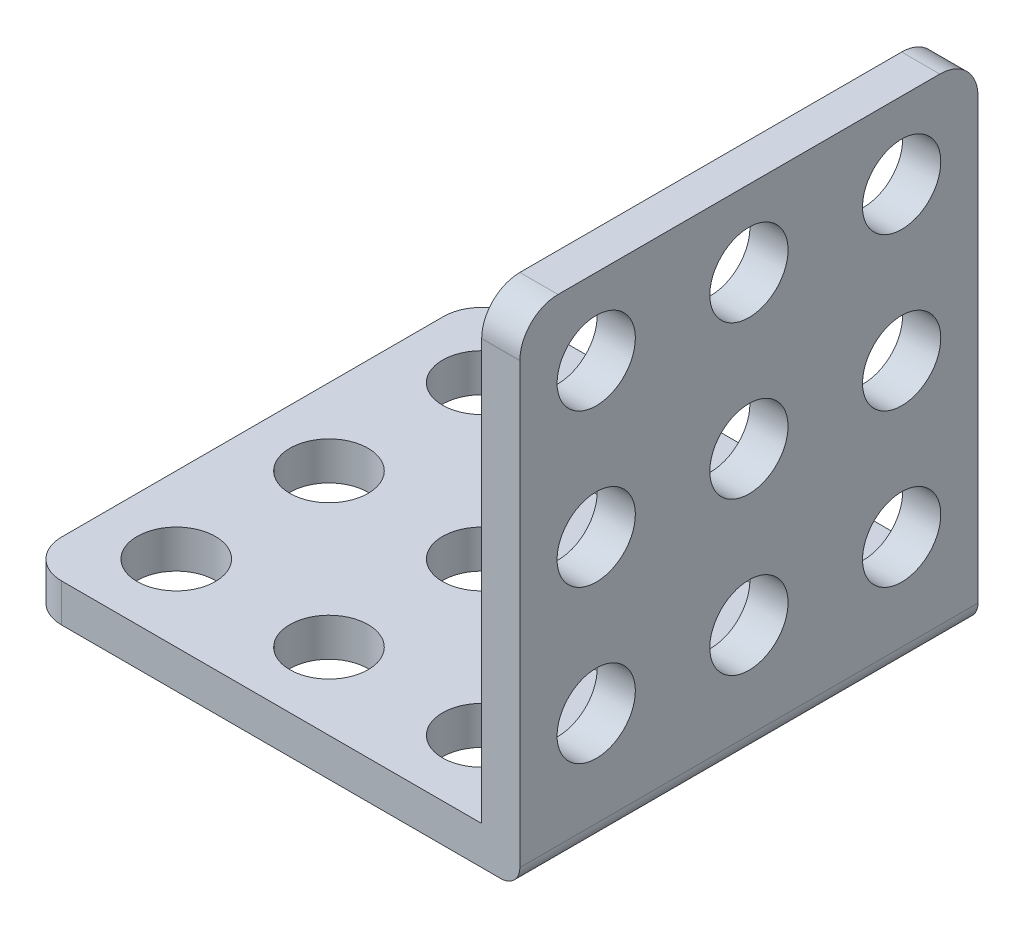
ISO-10303-21;
HEADER;
FILE_DESCRIPTION(('STEP AP214'),'2;1');
FILE_NAME('part.step','',(''),(''),'','','');
FILE_SCHEMA(('AUTOMOTIVE_DESIGN { 1 0 10303 214 1 1 1 1 }'));
ENDSEC;
DATA;
#1=APPLICATION_CONTEXT('core data for automotive mechanical design processes');
#2=APPLICATION_PROTOCOL_DEFINITION('international standard','automotive_design',2000,#1);
#3=PRODUCT_CONTEXT('',#1,'mechanical');
#4=PRODUCT('Part','Part','',(#3));
#5=PRODUCT_RELATED_PRODUCT_CATEGORY('part','',(#4));
#6=PRODUCT_DEFINITION_FORMATION('','',#4);
#7=PRODUCT_DEFINITION_CONTEXT('part definition',#1,'design');
#8=PRODUCT_DEFINITION('design','',#6,#7);
#9=PRODUCT_DEFINITION_SHAPE('','',#8);
#10=(LENGTH_UNIT() NAMED_UNIT(*) SI_UNIT(.MILLI.,.METRE.));
#11=(NAMED_UNIT(*) PLANE_ANGLE_UNIT() SI_UNIT($,.RADIAN.));
#12=(NAMED_UNIT(*) SI_UNIT($,.STERADIAN.) SOLID_ANGLE_UNIT());
#13=UNCERTAINTY_MEASURE_WITH_UNIT(LENGTH_MEASURE(1.E-05),#10,'distance_accuracy_value','');
#14=(GEOMETRIC_REPRESENTATION_CONTEXT(3) GLOBAL_UNCERTAINTY_ASSIGNED_CONTEXT((#13)) GLOBAL_UNIT_ASSIGNED_CONTEXT((#10,
#11,#12)) REPRESENTATION_CONTEXT('',''));
#15=CARTESIAN_POINT('',(0.,0.,0.));
#16=DIRECTION('',(0.,0.,1.));
#17=DIRECTION('',(1.,0.,0.));
#18=AXIS2_PLACEMENT_3D('',#15,#16,#17);
#19=CARTESIAN_POINT('',(-24.,-2.,24.));
#20=DIRECTION('',(1.,0.,0.));
#21=DIRECTION('',(0.,0.,-1.));
#22=AXIS2_PLACEMENT_3D('',#19,#20,#21);
#23=PLANE('',#22);
#24=DIRECTION('',(0.,0.,-1.));
#25=VECTOR('',#24,1.);
#26=CARTESIAN_POINT('',(-24.,0.,24.));
#27=LINE('',#26,#25);
#28=CARTESIAN_POINT('',(-24.,0.,22.));
#29=VERTEX_POINT('',#28);
#30=CARTESIAN_POINT('',(-24.,0.,2.));
#31=VERTEX_POINT('',#30);
#32=EDGE_CURVE('E173',#29,#31,#27,.T.);
#33=ORIENTED_EDGE('',*,*,#32,.T.);
#34=DIRECTION('',(0.,-1.,0.));
#35=VECTOR('',#34,1.);
#36=CARTESIAN_POINT('',(-24.,-2.,2.));
#37=LINE('',#36,#35);
#38=CARTESIAN_POINT('',(-24.,-2.,2.));
#39=VERTEX_POINT('',#38);
#40=EDGE_CURVE('E213',#31,#39,#37,.T.);
#41=ORIENTED_EDGE('',*,*,#40,.T.);
#42=DIRECTION('',(0.,0.,-1.));
#43=VECTOR('',#42,1.);
#44=CARTESIAN_POINT('',(-24.,-2.,24.));
#45=LINE('',#44,#43);
#46=CARTESIAN_POINT('',(-24.,-2.,22.));
#47=VERTEX_POINT('',#46);
#48=EDGE_CURVE('E197',#47,#39,#45,.T.);
#49=ORIENTED_EDGE('',*,*,#48,.F.);
#50=DIRECTION('',(0.,-1.,0.));
#51=VECTOR('',#50,1.);
#52=CARTESIAN_POINT('',(-24.,-2.,22.));
#53=LINE('',#52,#51);
#54=EDGE_CURVE('E211',#47,#29,#53,.F.);
#55=ORIENTED_EDGE('',*,*,#54,.T.);
#56=EDGE_LOOP('',(#33,#41,#49,#55));
#57=FACE_BOUND('',#56,.T.);
#58=ADVANCED_FACE('F67',(#57),#23,.F.);
#59=CARTESIAN_POINT('',(2.,-2.,24.));
#60=DIRECTION('',(0.,1.,0.));
#61=DIRECTION('',(-1.,0.,0.));
#62=AXIS2_PLACEMENT_3D('',#59,#60,#61);
#63=PLANE('',#62);
#64=CARTESIAN_POINT('',(-11.9999999999998,-2.,20.));
#65=DIRECTION('',(0.,1.,0.));
#66=DIRECTION('',(0.,0.,1.));
#67=AXIS2_PLACEMENT_3D('',#64,#65,#66);
#68=CIRCLE('',#67,2.05);
#69=CARTESIAN_POINT('',(-11.9999999999998,-2.,22.05));
#70=VERTEX_POINT('',#69);
#71=EDGE_CURVE('E294',#70,#70,#68,.T.);
#72=ORIENTED_EDGE('',*,*,#71,.T.);
#73=EDGE_LOOP('',(#72));
#74=FACE_BOUND('',#73,.T.);
#75=CARTESIAN_POINT('',(-3.99999999999983,-2.,20.));
#76=DIRECTION('',(0.,1.,0.));
#77=DIRECTION('',(0.,0.,1.));
#78=AXIS2_PLACEMENT_3D('',#75,#76,#77);
#79=CIRCLE('',#78,2.05);
#80=CARTESIAN_POINT('',(-3.99999999999983,-2.,22.05));
#81=VERTEX_POINT('',#80);
#82=EDGE_CURVE('E288',#81,#81,#79,.T.);
#83=ORIENTED_EDGE('',*,*,#82,.T.);
#84=EDGE_LOOP('',(#83));
#85=FACE_BOUND('',#84,.T.);
#86=CARTESIAN_POINT('',(-19.9999999999998,-2.,20.));
#87=DIRECTION('',(0.,1.,0.));
#88=DIRECTION('',(0.,0.,1.));
#89=AXIS2_PLACEMENT_3D('',#86,#87,#88);
#90=CIRCLE('',#89,2.05);
#91=CARTESIAN_POINT('',(-19.9999999999998,-2.,22.05));
#92=VERTEX_POINT('',#91);
#93=EDGE_CURVE('E282',#92,#92,#90,.T.);
#94=ORIENTED_EDGE('',*,*,#93,.T.);
#95=EDGE_LOOP('',(#94));
#96=FACE_BOUND('',#95,.T.);
#97=CARTESIAN_POINT('',(-11.9999999999999,-2.,12.));
#98=DIRECTION('',(0.,1.,0.));
#99=DIRECTION('',(0.,0.,1.));
#100=AXIS2_PLACEMENT_3D('',#97,#98,#99);
#101=CIRCLE('',#100,2.05);
#102=CARTESIAN_POINT('',(-11.9999999999999,-2.,14.05));
#103=VERTEX_POINT('',#102);
#104=EDGE_CURVE('E276',#103,#103,#101,.T.);
#105=ORIENTED_EDGE('',*,*,#104,.T.);
#106=EDGE_LOOP('',(#105));
#107=FACE_BOUND('',#106,.T.);
#108=CARTESIAN_POINT('',(-3.99999999999991,-2.,12.));
#109=DIRECTION('',(0.,1.,0.));
#110=DIRECTION('',(0.,0.,1.));
#111=AXIS2_PLACEMENT_3D('',#108,#109,#110);
#112=CIRCLE('',#111,2.05);
#113=CARTESIAN_POINT('',(-3.99999999999991,-2.,14.05));
#114=VERTEX_POINT('',#113);
#115=EDGE_CURVE('E270',#114,#114,#112,.T.);
#116=ORIENTED_EDGE('',*,*,#115,.T.);
#117=EDGE_LOOP('',(#116));
#118=FACE_BOUND('',#117,.T.);
#119=CARTESIAN_POINT('',(-12.,-2.,4.));
#120=DIRECTION('',(0.,1.,0.));
#121=DIRECTION('',(0.,0.,1.));
#122=AXIS2_PLACEMENT_3D('',#119,#120,#121);
#123=CIRCLE('',#122,2.05);
#124=CARTESIAN_POINT('',(-12.,-2.,6.05));
#125=VERTEX_POINT('',#124);
#126=EDGE_CURVE('E264',#125,#125,#123,.T.);
#127=ORIENTED_EDGE('',*,*,#126,.T.);
#128=EDGE_LOOP('',(#127));
#129=FACE_BOUND('',#128,.T.);
#130=CARTESIAN_POINT('',(-4.,-2.,4.));
#131=DIRECTION('',(0.,1.,0.));
#132=DIRECTION('',(0.,0.,1.));
#133=AXIS2_PLACEMENT_3D('',#130,#131,#132);
#134=CIRCLE('',#133,2.05);
#135=CARTESIAN_POINT('',(-4.,-2.,6.05));
#136=VERTEX_POINT('',#135);
#137=EDGE_CURVE('E258',#136,#136,#134,.T.);
#138=ORIENTED_EDGE('',*,*,#137,.T.);
#139=EDGE_LOOP('',(#138));
#140=FACE_BOUND('',#139,.T.);
#141=CARTESIAN_POINT('',(-20.,-2.,4.));
#142=DIRECTION('',(0.,1.,0.));
#143=DIRECTION('',(0.,0.,1.));
#144=AXIS2_PLACEMENT_3D('',#141,#142,#143);
#145=CIRCLE('',#144,2.05);
#146=CARTESIAN_POINT('',(-20.,-2.,6.05));
#147=VERTEX_POINT('',#146);
#148=EDGE_CURVE('E252',#147,#147,#145,.T.);
#149=ORIENTED_EDGE('',*,*,#148,.T.);
#150=EDGE_LOOP('',(#149));
#151=FACE_BOUND('',#150,.T.);
#152=CARTESIAN_POINT('',(-19.9999999999999,-2.,12.));
#153=DIRECTION('',(0.,1.,0.));
#154=DIRECTION('',(0.,0.,1.));
#155=AXIS2_PLACEMENT_3D('',#152,#153,#154);
#156=CIRCLE('',#155,2.05);
#157=CARTESIAN_POINT('',(-19.9999999999999,-2.,14.05));
#158=VERTEX_POINT('',#157);
#159=EDGE_CURVE('E187',#158,#158,#156,.T.);
#160=ORIENTED_EDGE('',*,*,#159,.T.);
#161=EDGE_LOOP('',(#160));
#162=FACE_BOUND('',#161,.T.);
#163=ORIENTED_EDGE('',*,*,#48,.T.);
#164=CARTESIAN_POINT('',(-22.,-2.,2.));
#165=DIRECTION('',(0.,1.,0.));
#166=DIRECTION('',(-1.,0.,0.));
#167=AXIS2_PLACEMENT_3D('',#164,#165,#166);
#168=CIRCLE('',#167,2.);
#169=CARTESIAN_POINT('',(-22.,-2.,0.));
#170=VERTEX_POINT('',#169);
#171=EDGE_CURVE('E218',#39,#170,#168,.F.);
#172=ORIENTED_EDGE('',*,*,#171,.T.);
#173=DIRECTION('',(1.,0.,0.));
#174=VECTOR('',#173,1.);
#175=CARTESIAN_POINT('',(2.,-2.,0.));
#176=LINE('',#175,#174);
#177=CARTESIAN_POINT('',(1.,-2.,0.));
#178=VERTEX_POINT('',#177);
#179=EDGE_CURVE('E184',#170,#178,#176,.T.);
#180=ORIENTED_EDGE('',*,*,#179,.T.);
#181=DIRECTION('',(0.,0.,-1.));
#182=VECTOR('',#181,1.);
#183=CARTESIAN_POINT('',(1.,-2.,24.));
#184=LINE('',#183,#182);
#185=CARTESIAN_POINT('',(1.,-2.,24.));
#186=VERTEX_POINT('',#185);
#187=EDGE_CURVE('E206',#178,#186,#184,.F.);
#188=ORIENTED_EDGE('',*,*,#187,.T.);
#189=DIRECTION('',(1.,0.,0.));
#190=VECTOR('',#189,1.);
#191=CARTESIAN_POINT('',(2.,-2.,24.));
#192=LINE('',#191,#190);
#193=CARTESIAN_POINT('',(-22.,-2.,24.));
#194=VERTEX_POINT('',#193);
#195=EDGE_CURVE('E191',#194,#186,#192,.T.);
#196=ORIENTED_EDGE('',*,*,#195,.F.);
#197=CARTESIAN_POINT('',(-22.,-2.,22.));
#198=DIRECTION('',(0.,1.,0.));
#199=DIRECTION('',(-1.,0.,0.));
#200=AXIS2_PLACEMENT_3D('',#197,#198,#199);
#201=CIRCLE('',#200,2.);
#202=EDGE_CURVE('E216',#194,#47,#201,.F.);
#203=ORIENTED_EDGE('',*,*,#202,.T.);
#204=EDGE_LOOP('',(#163,#172,#180,#188,#196,#203));
#205=FACE_BOUND('',#204,.T.);
#206=ADVANCED_FACE('F404',(#74,#85,#96,#107,#118,#129,#140,#151,#162,#205),#63,.F.);
#207=CARTESIAN_POINT('',(2.,24.,24.));
#208=DIRECTION('',(-1.,0.,0.));
#209=DIRECTION('',(0.,-1.,0.));
#210=AXIS2_PLACEMENT_3D('',#207,#208,#209);
#211=PLANE('',#210);
#212=CARTESIAN_POINT('',(2.,11.9999999999999,4.));
#213=DIRECTION('',(-1.,0.,0.));
#214=DIRECTION('',(0.,-1.,0.));
#215=AXIS2_PLACEMENT_3D('',#212,#213,#214);
#216=CIRCLE('',#215,2.05);
#217=CARTESIAN_POINT('',(2.,9.9499999999999,4.));
#218=VERTEX_POINT('',#217);
#219=EDGE_CURVE('E348',#218,#218,#216,.T.);
#220=ORIENTED_EDGE('',*,*,#219,.T.);
#221=EDGE_LOOP('',(#220));
#222=FACE_BOUND('',#221,.T.);
#223=CARTESIAN_POINT('',(2.,19.9999999999999,4.));
#224=DIRECTION('',(-1.,0.,0.));
#225=DIRECTION('',(0.,-1.,0.));
#226=AXIS2_PLACEMENT_3D('',#223,#224,#225);
#227=CIRCLE('',#226,2.05);
#228=CARTESIAN_POINT('',(2.,17.9499999999999,4.));
#229=VERTEX_POINT('',#228);
#230=EDGE_CURVE('E342',#229,#229,#227,.T.);
#231=ORIENTED_EDGE('',*,*,#230,.T.);
#232=EDGE_LOOP('',(#231));
#233=FACE_BOUND('',#232,.T.);
#234=CARTESIAN_POINT('',(2.,3.9999999999999,4.));
#235=DIRECTION('',(-1.,0.,0.));
#236=DIRECTION('',(0.,-1.,0.));
#237=AXIS2_PLACEMENT_3D('',#234,#235,#236);
#238=CIRCLE('',#237,2.05);
#239=CARTESIAN_POINT('',(2.,1.9499999999999,4.));
#240=VERTEX_POINT('',#239);
#241=EDGE_CURVE('E336',#240,#240,#238,.T.);
#242=ORIENTED_EDGE('',*,*,#241,.T.);
#243=EDGE_LOOP('',(#242));
#244=FACE_BOUND('',#243,.T.);
#245=CARTESIAN_POINT('',(2.,11.9999999999999,12.));
#246=DIRECTION('',(-1.,0.,0.));
#247=DIRECTION('',(0.,-1.,0.));
#248=AXIS2_PLACEMENT_3D('',#245,#246,#247);
#249=CIRCLE('',#248,2.05);
#250=CARTESIAN_POINT('',(2.,9.94999999999995,12.));
#251=VERTEX_POINT('',#250);
#252=EDGE_CURVE('E330',#251,#251,#249,.T.);
#253=ORIENTED_EDGE('',*,*,#252,.T.);
#254=EDGE_LOOP('',(#253));
#255=FACE_BOUND('',#254,.T.);
#256=CARTESIAN_POINT('',(2.,12.,20.));
#257=DIRECTION('',(-1.,0.,0.));
#258=DIRECTION('',(0.,-1.,0.));
#259=AXIS2_PLACEMENT_3D('',#256,#257,#258);
#260=CIRCLE('',#259,2.05);
#261=CARTESIAN_POINT('',(2.,9.95,20.));
#262=VERTEX_POINT('',#261);
#263=EDGE_CURVE('E324',#262,#262,#260,.T.);
#264=ORIENTED_EDGE('',*,*,#263,.T.);
#265=EDGE_LOOP('',(#264));
#266=FACE_BOUND('',#265,.T.);
#267=CARTESIAN_POINT('',(2.,19.9999999999999,12.));
#268=DIRECTION('',(-1.,0.,0.));
#269=DIRECTION('',(0.,-1.,0.));
#270=AXIS2_PLACEMENT_3D('',#267,#268,#269);
#271=CIRCLE('',#270,2.05);
#272=CARTESIAN_POINT('',(2.,17.9499999999999,12.));
#273=VERTEX_POINT('',#272);
#274=EDGE_CURVE('E318',#273,#273,#271,.T.);
#275=ORIENTED_EDGE('',*,*,#274,.T.);
#276=EDGE_LOOP('',(#275));
#277=FACE_BOUND('',#276,.T.);
#278=CARTESIAN_POINT('',(2.,20.,20.));
#279=DIRECTION('',(-1.,0.,0.));
#280=DIRECTION('',(0.,-1.,0.));
#281=AXIS2_PLACEMENT_3D('',#278,#279,#280);
#282=CIRCLE('',#281,2.05);
#283=CARTESIAN_POINT('',(2.,17.95,20.));
#284=VERTEX_POINT('',#283);
#285=EDGE_CURVE('E312',#284,#284,#282,.T.);
#286=ORIENTED_EDGE('',*,*,#285,.T.);
#287=EDGE_LOOP('',(#286));
#288=FACE_BOUND('',#287,.T.);
#289=CARTESIAN_POINT('',(2.,4.,20.));
#290=DIRECTION('',(-1.,0.,0.));
#291=DIRECTION('',(0.,-1.,0.));
#292=AXIS2_PLACEMENT_3D('',#289,#290,#291);
#293=CIRCLE('',#292,2.05);
#294=CARTESIAN_POINT('',(2.,1.95,20.));
#295=VERTEX_POINT('',#294);
#296=EDGE_CURVE('E306',#295,#295,#293,.T.);
#297=ORIENTED_EDGE('',*,*,#296,.T.);
#298=EDGE_LOOP('',(#297));
#299=FACE_BOUND('',#298,.T.);
#300=CARTESIAN_POINT('',(2.,3.99999999999995,12.));
#301=DIRECTION('',(-1.,0.,0.));
#302=DIRECTION('',(0.,-1.,0.));
#303=AXIS2_PLACEMENT_3D('',#300,#301,#302);
#304=CIRCLE('',#303,2.05);
#305=CARTESIAN_POINT('',(2.,1.94999999999995,12.));
#306=VERTEX_POINT('',#305);
#307=EDGE_CURVE('E300',#306,#306,#304,.T.);
#308=ORIENTED_EDGE('',*,*,#307,.T.);
#309=EDGE_LOOP('',(#308));
#310=FACE_BOUND('',#309,.T.);
#311=DIRECTION('',(0.,0.,-1.));
#312=VECTOR('',#311,1.);
#313=CARTESIAN_POINT('',(2.,24.,24.));
#314=LINE('',#313,#312);
#315=CARTESIAN_POINT('',(2.,24.,22.));
#316=VERTEX_POINT('',#315);
#317=CARTESIAN_POINT('',(2.,24.,2.));
#318=VERTEX_POINT('',#317);
#319=EDGE_CURVE('E195',#316,#318,#314,.T.);
#320=ORIENTED_EDGE('',*,*,#319,.F.);
#321=CARTESIAN_POINT('',(2.,22.,22.));
#322=DIRECTION('',(-1.,0.,0.));
#323=DIRECTION('',(0.,-1.,0.));
#324=AXIS2_PLACEMENT_3D('',#321,#322,#323);
#325=CIRCLE('',#324,2.);
#326=CARTESIAN_POINT('',(2.,22.,24.));
#327=VERTEX_POINT('',#326);
#328=EDGE_CURVE('E12',#316,#327,#325,.F.);
#329=ORIENTED_EDGE('',*,*,#328,.T.);
#330=DIRECTION('',(0.,1.,0.));
#331=VECTOR('',#330,1.);
#332=CARTESIAN_POINT('',(2.,24.,24.));
#333=LINE('',#332,#331);
#334=CARTESIAN_POINT('',(2.,-0.999999999999997,24.));
#335=VERTEX_POINT('',#334);
#336=EDGE_CURVE('E162',#335,#327,#333,.T.);
#337=ORIENTED_EDGE('',*,*,#336,.F.);
#338=DIRECTION('',(0.,0.,-1.));
#339=VECTOR('',#338,1.);
#340=CARTESIAN_POINT('',(2.,-0.999999999999997,24.));
#341=LINE('',#340,#339);
#342=CARTESIAN_POINT('',(2.,-0.999999999999997,0.));
#343=VERTEX_POINT('',#342);
#344=EDGE_CURVE('E200',#335,#343,#341,.T.);
#345=ORIENTED_EDGE('',*,*,#344,.T.);
#346=DIRECTION('',(0.,1.,0.));
#347=VECTOR('',#346,1.);
#348=CARTESIAN_POINT('',(2.,24.,0.));
#349=LINE('',#348,#347);
#350=CARTESIAN_POINT('',(2.,22.,0.));
#351=VERTEX_POINT('',#350);
#352=EDGE_CURVE('E186',#343,#351,#349,.T.);
#353=ORIENTED_EDGE('',*,*,#352,.T.);
#354=CARTESIAN_POINT('',(2.,22.,2.));
#355=DIRECTION('',(-1.,0.,0.));
#356=DIRECTION('',(0.,-1.,0.));
#357=AXIS2_PLACEMENT_3D('',#354,#355,#356);
#358=CIRCLE('',#357,2.);
#359=EDGE_CURVE('E75',#351,#318,#358,.F.);
#360=ORIENTED_EDGE('',*,*,#359,.T.);
#361=EDGE_LOOP('',(#320,#329,#337,#345,#353,#360));
#362=FACE_BOUND('',#361,.T.);
#363=ADVANCED_FACE('F244',(#222,#233,#244,#255,#266,#277,#288,#299,#310,#362),#211,.F.);
#364=CARTESIAN_POINT('',(0.,24.,24.));
#365=DIRECTION('',(0.,-1.,0.));
#366=DIRECTION('',(0.,0.,-1.));
#367=AXIS2_PLACEMENT_3D('',#364,#365,#366);
#368=PLANE('',#367);
#369=DIRECTION('',(0.,0.,-1.));
#370=VECTOR('',#369,1.);
#371=CARTESIAN_POINT('',(0.,24.,24.));
#372=LINE('',#371,#370);
#373=CARTESIAN_POINT('',(0.,24.,22.));
#374=VERTEX_POINT('',#373);
#375=CARTESIAN_POINT('',(0.,24.,2.));
#376=VERTEX_POINT('',#375);
#377=EDGE_CURVE('E172',#374,#376,#372,.T.);
#378=ORIENTED_EDGE('',*,*,#377,.F.);
#379=DIRECTION('',(-1.,0.,0.));
#380=VECTOR('',#379,1.);
#381=CARTESIAN_POINT('',(0.,24.,22.));
#382=LINE('',#381,#380);
#383=EDGE_CURVE('E88',#374,#316,#382,.F.);
#384=ORIENTED_EDGE('',*,*,#383,.T.);
#385=ORIENTED_EDGE('',*,*,#319,.T.);
#386=DIRECTION('',(-1.,0.,0.));
#387=VECTOR('',#386,1.);
#388=CARTESIAN_POINT('',(0.,24.,2.));
#389=LINE('',#388,#387);
#390=EDGE_CURVE('E234',#318,#376,#389,.T.);
#391=ORIENTED_EDGE('',*,*,#390,.T.);
#392=EDGE_LOOP('',(#378,#384,#385,#391));
#393=FACE_BOUND('',#392,.T.);
#394=ADVANCED_FACE('F238',(#393),#368,.F.);
#395=CARTESIAN_POINT('',(0.,0.,24.));
#396=DIRECTION('',(1.,0.,0.));
#397=DIRECTION('',(0.,1.,0.));
#398=AXIS2_PLACEMENT_3D('',#395,#396,#397);
#399=PLANE('',#398);
#400=CARTESIAN_POINT('',(0.,11.9999999999999,4.));
#401=DIRECTION('',(-1.,0.,0.));
#402=DIRECTION('',(0.,-1.,0.));
#403=AXIS2_PLACEMENT_3D('',#400,#401,#402);
#404=CIRCLE('',#403,2.05);
#405=CARTESIAN_POINT('',(0.,9.9499999999999,4.));
#406=VERTEX_POINT('',#405);
#407=EDGE_CURVE('E351',#406,#406,#404,.T.);
#408=ORIENTED_EDGE('',*,*,#407,.F.);
#409=EDGE_LOOP('',(#408));
#410=FACE_BOUND('',#409,.T.);
#411=CARTESIAN_POINT('',(0.,19.9999999999999,4.));
#412=DIRECTION('',(-1.,0.,0.));
#413=DIRECTION('',(0.,-1.,0.));
#414=AXIS2_PLACEMENT_3D('',#411,#412,#413);
#415=CIRCLE('',#414,2.05);
#416=CARTESIAN_POINT('',(0.,17.9499999999999,4.));
#417=VERTEX_POINT('',#416);
#418=EDGE_CURVE('E345',#417,#417,#415,.T.);
#419=ORIENTED_EDGE('',*,*,#418,.F.);
#420=EDGE_LOOP('',(#419));
#421=FACE_BOUND('',#420,.T.);
#422=CARTESIAN_POINT('',(0.,3.9999999999999,4.));
#423=DIRECTION('',(-1.,0.,0.));
#424=DIRECTION('',(0.,-1.,0.));
#425=AXIS2_PLACEMENT_3D('',#422,#423,#424);
#426=CIRCLE('',#425,2.05);
#427=CARTESIAN_POINT('',(0.,1.9499999999999,4.));
#428=VERTEX_POINT('',#427);
#429=EDGE_CURVE('E339',#428,#428,#426,.T.);
#430=ORIENTED_EDGE('',*,*,#429,.F.);
#431=EDGE_LOOP('',(#430));
#432=FACE_BOUND('',#431,.T.);
#433=CARTESIAN_POINT('',(0.,11.9999999999999,12.));
#434=DIRECTION('',(-1.,0.,0.));
#435=DIRECTION('',(0.,-1.,0.));
#436=AXIS2_PLACEMENT_3D('',#433,#434,#435);
#437=CIRCLE('',#436,2.05);
#438=CARTESIAN_POINT('',(0.,9.94999999999995,12.));
#439=VERTEX_POINT('',#438);
#440=EDGE_CURVE('E333',#439,#439,#437,.T.);
#441=ORIENTED_EDGE('',*,*,#440,.F.);
#442=EDGE_LOOP('',(#441));
#443=FACE_BOUND('',#442,.T.);
#444=CARTESIAN_POINT('',(0.,12.,20.));
#445=DIRECTION('',(-1.,0.,0.));
#446=DIRECTION('',(0.,-1.,0.));
#447=AXIS2_PLACEMENT_3D('',#444,#445,#446);
#448=CIRCLE('',#447,2.05);
#449=CARTESIAN_POINT('',(0.,9.95,20.));
#450=VERTEX_POINT('',#449);
#451=EDGE_CURVE('E327',#450,#450,#448,.T.);
#452=ORIENTED_EDGE('',*,*,#451,.F.);
#453=EDGE_LOOP('',(#452));
#454=FACE_BOUND('',#453,.T.);
#455=CARTESIAN_POINT('',(0.,19.9999999999999,12.));
#456=DIRECTION('',(-1.,0.,0.));
#457=DIRECTION('',(0.,-1.,0.));
#458=AXIS2_PLACEMENT_3D('',#455,#456,#457);
#459=CIRCLE('',#458,2.05);
#460=CARTESIAN_POINT('',(0.,17.9499999999999,12.));
#461=VERTEX_POINT('',#460);
#462=EDGE_CURVE('E321',#461,#461,#459,.T.);
#463=ORIENTED_EDGE('',*,*,#462,.F.);
#464=EDGE_LOOP('',(#463));
#465=FACE_BOUND('',#464,.T.);
#466=CARTESIAN_POINT('',(0.,20.,20.));
#467=DIRECTION('',(-1.,0.,0.));
#468=DIRECTION('',(0.,-1.,0.));
#469=AXIS2_PLACEMENT_3D('',#466,#467,#468);
#470=CIRCLE('',#469,2.05);
#471=CARTESIAN_POINT('',(0.,17.95,20.));
#472=VERTEX_POINT('',#471);
#473=EDGE_CURVE('E315',#472,#472,#470,.T.);
#474=ORIENTED_EDGE('',*,*,#473,.F.);
#475=EDGE_LOOP('',(#474));
#476=FACE_BOUND('',#475,.T.);
#477=CARTESIAN_POINT('',(0.,4.,20.));
#478=DIRECTION('',(-1.,0.,0.));
#479=DIRECTION('',(0.,-1.,0.));
#480=AXIS2_PLACEMENT_3D('',#477,#478,#479);
#481=CIRCLE('',#480,2.05);
#482=CARTESIAN_POINT('',(0.,1.95,20.));
#483=VERTEX_POINT('',#482);
#484=EDGE_CURVE('E309',#483,#483,#481,.T.);
#485=ORIENTED_EDGE('',*,*,#484,.F.);
#486=EDGE_LOOP('',(#485));
#487=FACE_BOUND('',#486,.T.);
#488=CARTESIAN_POINT('',(0.,3.99999999999995,12.));
#489=DIRECTION('',(-1.,0.,0.));
#490=DIRECTION('',(0.,-1.,0.));
#491=AXIS2_PLACEMENT_3D('',#488,#489,#490);
#492=CIRCLE('',#491,2.05);
#493=CARTESIAN_POINT('',(0.,1.94999999999995,12.));
#494=VERTEX_POINT('',#493);
#495=EDGE_CURVE('E303',#494,#494,#492,.T.);
#496=ORIENTED_EDGE('',*,*,#495,.F.);
#497=EDGE_LOOP('',(#496));
#498=FACE_BOUND('',#497,.T.);
#499=DIRECTION('',(0.,-1.,0.));
#500=VECTOR('',#499,1.);
#501=CARTESIAN_POINT('',(0.,0.,24.));
#502=LINE('',#501,#500);
#503=CARTESIAN_POINT('',(0.,22.,24.));
#504=VERTEX_POINT('',#503);
#505=CARTESIAN_POINT('',(0.,0.,24.));
#506=VERTEX_POINT('',#505);
#507=EDGE_CURVE('E151',#504,#506,#502,.T.);
#508=ORIENTED_EDGE('',*,*,#507,.F.);
#509=CARTESIAN_POINT('',(0.,22.,22.));
#510=DIRECTION('',(1.,0.,0.));
#511=DIRECTION('',(0.,1.,0.));
#512=AXIS2_PLACEMENT_3D('',#509,#510,#511);
#513=CIRCLE('',#512,2.);
#514=EDGE_CURVE('E232',#504,#374,#513,.F.);
#515=ORIENTED_EDGE('',*,*,#514,.T.);
#516=ORIENTED_EDGE('',*,*,#377,.T.);
#517=CARTESIAN_POINT('',(0.,22.,2.));
#518=DIRECTION('',(1.,0.,0.));
#519=DIRECTION('',(0.,1.,0.));
#520=AXIS2_PLACEMENT_3D('',#517,#518,#519);
#521=CIRCLE('',#520,2.);
#522=CARTESIAN_POINT('',(0.,22.,0.));
#523=VERTEX_POINT('',#522);
#524=EDGE_CURVE('E230',#376,#523,#521,.F.);
#525=ORIENTED_EDGE('',*,*,#524,.T.);
#526=DIRECTION('',(0.,-1.,0.));
#527=VECTOR('',#526,1.);
#528=CARTESIAN_POINT('',(0.,0.,0.));
#529=LINE('',#528,#527);
#530=CARTESIAN_POINT('',(0.,0.,0.));
#531=VERTEX_POINT('',#530);
#532=EDGE_CURVE('E168',#523,#531,#529,.T.);
#533=ORIENTED_EDGE('',*,*,#532,.T.);
#534=DIRECTION('',(0.,0.,-1.));
#535=VECTOR('',#534,1.);
#536=CARTESIAN_POINT('',(0.,0.,24.));
#537=LINE('',#536,#535);
#538=EDGE_CURVE('E165',#506,#531,#537,.T.);
#539=ORIENTED_EDGE('',*,*,#538,.F.);
#540=EDGE_LOOP('',(#508,#515,#516,#525,#533,#539));
#541=FACE_BOUND('',#540,.T.);
#542=ADVANCED_FACE('F166',(#410,#421,#432,#443,#454,#465,#476,#487,#498,#541),#399,.F.);
#543=CARTESIAN_POINT('',(-24.,0.,24.));
#544=DIRECTION('',(0.,-1.,0.));
#545=DIRECTION('',(0.,0.,-1.));
#546=AXIS2_PLACEMENT_3D('',#543,#544,#545);
#547=PLANE('',#546);
#548=CARTESIAN_POINT('',(-11.9999999999998,0.,20.));
#549=DIRECTION('',(0.,1.,0.));
#550=DIRECTION('',(0.,0.,1.));
#551=AXIS2_PLACEMENT_3D('',#548,#549,#550);
#552=CIRCLE('',#551,2.05);
#553=CARTESIAN_POINT('',(-11.9999999999998,0.,22.05));
#554=VERTEX_POINT('',#553);
#555=EDGE_CURVE('E297',#554,#554,#552,.T.);
#556=ORIENTED_EDGE('',*,*,#555,.F.);
#557=EDGE_LOOP('',(#556));
#558=FACE_BOUND('',#557,.T.);
#559=CARTESIAN_POINT('',(-3.99999999999983,0.,20.));
#560=DIRECTION('',(0.,1.,0.));
#561=DIRECTION('',(0.,0.,1.));
#562=AXIS2_PLACEMENT_3D('',#559,#560,#561);
#563=CIRCLE('',#562,2.05);
#564=CARTESIAN_POINT('',(-3.99999999999983,0.,22.05));
#565=VERTEX_POINT('',#564);
#566=EDGE_CURVE('E291',#565,#565,#563,.T.);
#567=ORIENTED_EDGE('',*,*,#566,.F.);
#568=EDGE_LOOP('',(#567));
#569=FACE_BOUND('',#568,.T.);
#570=CARTESIAN_POINT('',(-19.9999999999998,0.,20.));
#571=DIRECTION('',(0.,1.,0.));
#572=DIRECTION('',(0.,0.,1.));
#573=AXIS2_PLACEMENT_3D('',#570,#571,#572);
#574=CIRCLE('',#573,2.05);
#575=CARTESIAN_POINT('',(-19.9999999999998,0.,22.05));
#576=VERTEX_POINT('',#575);
#577=EDGE_CURVE('E285',#576,#576,#574,.T.);
#578=ORIENTED_EDGE('',*,*,#577,.F.);
#579=EDGE_LOOP('',(#578));
#580=FACE_BOUND('',#579,.T.);
#581=CARTESIAN_POINT('',(-11.9999999999999,0.,12.));
#582=DIRECTION('',(0.,1.,0.));
#583=DIRECTION('',(0.,0.,1.));
#584=AXIS2_PLACEMENT_3D('',#581,#582,#583);
#585=CIRCLE('',#584,2.05);
#586=CARTESIAN_POINT('',(-11.9999999999999,0.,14.05));
#587=VERTEX_POINT('',#586);
#588=EDGE_CURVE('E279',#587,#587,#585,.T.);
#589=ORIENTED_EDGE('',*,*,#588,.F.);
#590=EDGE_LOOP('',(#589));
#591=FACE_BOUND('',#590,.T.);
#592=CARTESIAN_POINT('',(-3.99999999999991,0.,12.));
#593=DIRECTION('',(0.,1.,0.));
#594=DIRECTION('',(0.,0.,1.));
#595=AXIS2_PLACEMENT_3D('',#592,#593,#594);
#596=CIRCLE('',#595,2.05);
#597=CARTESIAN_POINT('',(-3.99999999999991,0.,14.05));
#598=VERTEX_POINT('',#597);
#599=EDGE_CURVE('E273',#598,#598,#596,.T.);
#600=ORIENTED_EDGE('',*,*,#599,.F.);
#601=EDGE_LOOP('',(#600));
#602=FACE_BOUND('',#601,.T.);
#603=CARTESIAN_POINT('',(-12.,0.,4.));
#604=DIRECTION('',(0.,1.,0.));
#605=DIRECTION('',(0.,0.,1.));
#606=AXIS2_PLACEMENT_3D('',#603,#604,#605);
#607=CIRCLE('',#606,2.05);
#608=CARTESIAN_POINT('',(-12.,0.,6.05));
#609=VERTEX_POINT('',#608);
#610=EDGE_CURVE('E267',#609,#609,#607,.T.);
#611=ORIENTED_EDGE('',*,*,#610,.F.);
#612=EDGE_LOOP('',(#611));
#613=FACE_BOUND('',#612,.T.);
#614=CARTESIAN_POINT('',(-4.,0.,4.));
#615=DIRECTION('',(0.,1.,0.));
#616=DIRECTION('',(0.,0.,1.));
#617=AXIS2_PLACEMENT_3D('',#614,#615,#616);
#618=CIRCLE('',#617,2.05);
#619=CARTESIAN_POINT('',(-4.,0.,6.05));
#620=VERTEX_POINT('',#619);
#621=EDGE_CURVE('E261',#620,#620,#618,.T.);
#622=ORIENTED_EDGE('',*,*,#621,.F.);
#623=EDGE_LOOP('',(#622));
#624=FACE_BOUND('',#623,.T.);
#625=CARTESIAN_POINT('',(-20.,0.,4.));
#626=DIRECTION('',(0.,1.,0.));
#627=DIRECTION('',(0.,0.,1.));
#628=AXIS2_PLACEMENT_3D('',#625,#626,#627);
#629=CIRCLE('',#628,2.05);
#630=CARTESIAN_POINT('',(-20.,0.,6.05));
#631=VERTEX_POINT('',#630);
#632=EDGE_CURVE('E255',#631,#631,#629,.T.);
#633=ORIENTED_EDGE('',*,*,#632,.F.);
#634=EDGE_LOOP('',(#633));
#635=FACE_BOUND('',#634,.T.);
#636=CARTESIAN_POINT('',(-19.9999999999999,0.,12.));
#637=DIRECTION('',(0.,1.,0.));
#638=DIRECTION('',(0.,0.,1.));
#639=AXIS2_PLACEMENT_3D('',#636,#637,#638);
#640=CIRCLE('',#639,2.05);
#641=CARTESIAN_POINT('',(-19.9999999999999,0.,14.05));
#642=VERTEX_POINT('',#641);
#643=EDGE_CURVE('E249',#642,#642,#640,.T.);
#644=ORIENTED_EDGE('',*,*,#643,.F.);
#645=EDGE_LOOP('',(#644));
#646=FACE_BOUND('',#645,.T.);
#647=DIRECTION('',(-1.,0.,0.));
#648=VECTOR('',#647,1.);
#649=CARTESIAN_POINT('',(-24.,0.,0.));
#650=LINE('',#649,#648);
#651=CARTESIAN_POINT('',(-22.,0.,0.));
#652=VERTEX_POINT('',#651);
#653=EDGE_CURVE('E190',#531,#652,#650,.T.);
#654=ORIENTED_EDGE('',*,*,#653,.T.);
#655=CARTESIAN_POINT('',(-22.,0.,2.));
#656=DIRECTION('',(0.,-1.,0.));
#657=DIRECTION('',(0.,0.,-1.));
#658=AXIS2_PLACEMENT_3D('',#655,#656,#657);
#659=CIRCLE('',#658,2.);
#660=EDGE_CURVE('E225',#652,#31,#659,.F.);
#661=ORIENTED_EDGE('',*,*,#660,.T.);
#662=ORIENTED_EDGE('',*,*,#32,.F.);
#663=CARTESIAN_POINT('',(-22.,0.,22.));
#664=DIRECTION('',(0.,-1.,0.));
#665=DIRECTION('',(0.,0.,-1.));
#666=AXIS2_PLACEMENT_3D('',#663,#664,#665);
#667=CIRCLE('',#666,2.);
#668=CARTESIAN_POINT('',(-22.,0.,24.));
#669=VERTEX_POINT('',#668);
#670=EDGE_CURVE('E178',#29,#669,#667,.F.);
#671=ORIENTED_EDGE('',*,*,#670,.T.);
#672=DIRECTION('',(-1.,0.,0.));
#673=VECTOR('',#672,1.);
#674=CARTESIAN_POINT('',(-24.,0.,24.));
#675=LINE('',#674,#673);
#676=EDGE_CURVE('E156',#506,#669,#675,.T.);
#677=ORIENTED_EDGE('',*,*,#676,.F.);
#678=ORIENTED_EDGE('',*,*,#538,.T.);
#679=EDGE_LOOP('',(#654,#661,#662,#671,#677,#678));
#680=FACE_BOUND('',#679,.T.);
#681=ADVANCED_FACE('F175',(#558,#569,#580,#591,#602,#613,#624,#635,#646,#680),#547,.F.);
#682=CARTESIAN_POINT('',(-24.,0.,24.));
#683=DIRECTION('',(0.,0.,-1.));
#684=DIRECTION('',(-1.,0.,0.));
#685=AXIS2_PLACEMENT_3D('',#682,#683,#684);
#686=PLANE('',#685);
#687=ORIENTED_EDGE('',*,*,#676,.T.);
#688=DIRECTION('',(0.,-1.,0.));
#689=VECTOR('',#688,1.);
#690=CARTESIAN_POINT('',(-22.,0.,24.));
#691=LINE('',#690,#689);
#692=EDGE_CURVE('E228',#669,#194,#691,.T.);
#693=ORIENTED_EDGE('',*,*,#692,.T.);
#694=ORIENTED_EDGE('',*,*,#195,.T.);
#695=CARTESIAN_POINT('',(1.,-0.999999999999997,24.));
#696=DIRECTION('',(0.,0.,-1.));
#697=DIRECTION('',(-1.,0.,0.));
#698=AXIS2_PLACEMENT_3D('',#695,#696,#697);
#699=CIRCLE('',#698,1.);
#700=EDGE_CURVE('E209',#186,#335,#699,.F.);
#701=ORIENTED_EDGE('',*,*,#700,.T.);
#702=ORIENTED_EDGE('',*,*,#336,.T.);
#703=DIRECTION('',(-1.,0.,0.));
#704=VECTOR('',#703,1.);
#705=CARTESIAN_POINT('',(-24.,22.,24.));
#706=LINE('',#705,#704);
#707=EDGE_CURVE('E160',#327,#504,#706,.T.);
#708=ORIENTED_EDGE('',*,*,#707,.T.);
#709=ORIENTED_EDGE('',*,*,#507,.T.);
#710=EDGE_LOOP('',(#687,#693,#694,#701,#702,#708,#709));
#711=FACE_BOUND('',#710,.T.);
#712=ADVANCED_FACE('F153',(#711),#686,.F.);
#713=CARTESIAN_POINT('',(-24.,0.,0.));
#714=DIRECTION('',(0.,0.,-1.));
#715=DIRECTION('',(-1.,0.,0.));
#716=AXIS2_PLACEMENT_3D('',#713,#714,#715);
#717=PLANE('',#716);
#718=ORIENTED_EDGE('',*,*,#179,.F.);
#719=DIRECTION('',(0.,-1.,0.));
#720=VECTOR('',#719,1.);
#721=CARTESIAN_POINT('',(-22.,0.,0.));
#722=LINE('',#721,#720);
#723=EDGE_CURVE('E222',#170,#652,#722,.F.);
#724=ORIENTED_EDGE('',*,*,#723,.T.);
#725=ORIENTED_EDGE('',*,*,#653,.F.);
#726=ORIENTED_EDGE('',*,*,#532,.F.);
#727=DIRECTION('',(-1.,0.,0.));
#728=VECTOR('',#727,1.);
#729=CARTESIAN_POINT('',(2.,22.,0.));
#730=LINE('',#729,#728);
#731=EDGE_CURVE('E220',#523,#351,#730,.F.);
#732=ORIENTED_EDGE('',*,*,#731,.T.);
#733=ORIENTED_EDGE('',*,*,#352,.F.);
#734=CARTESIAN_POINT('',(1.,-0.999999999999997,0.));
#735=DIRECTION('',(0.,0.,-1.));
#736=DIRECTION('',(-1.,0.,0.));
#737=AXIS2_PLACEMENT_3D('',#734,#735,#736);
#738=CIRCLE('',#737,1.);
#739=EDGE_CURVE('E203',#343,#178,#738,.T.);
#740=ORIENTED_EDGE('',*,*,#739,.T.);
#741=EDGE_LOOP('',(#718,#724,#725,#726,#732,#733,#740));
#742=FACE_BOUND('',#741,.T.);
#743=ADVANCED_FACE('F434',(#742),#717,.T.);
#744=CARTESIAN_POINT('',(-19.9999999999999,-2.,12.));
#745=DIRECTION('',(0.,1.,0.));
#746=DIRECTION('',(0.,0.,1.));
#747=AXIS2_PLACEMENT_3D('',#744,#745,#746);
#748=CYLINDRICAL_SURFACE('',#747,2.05);
#749=ORIENTED_EDGE('',*,*,#159,.F.);
#750=EDGE_LOOP('',(#749));
#751=FACE_BOUND('',#750,.T.);
#752=ORIENTED_EDGE('',*,*,#643,.T.);
#753=EDGE_LOOP('',(#752));
#754=FACE_BOUND('',#753,.T.);
#755=ADVANCED_FACE('F444',(#751,#754),#748,.F.);
#756=CARTESIAN_POINT('',(-20.,-2.,4.));
#757=DIRECTION('',(0.,1.,0.));
#758=DIRECTION('',(0.,0.,1.));
#759=AXIS2_PLACEMENT_3D('',#756,#757,#758);
#760=CYLINDRICAL_SURFACE('',#759,2.05);
#761=ORIENTED_EDGE('',*,*,#148,.F.);
#762=EDGE_LOOP('',(#761));
#763=FACE_BOUND('',#762,.T.);
#764=ORIENTED_EDGE('',*,*,#632,.T.);
#765=EDGE_LOOP('',(#764));
#766=FACE_BOUND('',#765,.T.);
#767=ADVANCED_FACE('F450',(#763,#766),#760,.F.);
#768=CARTESIAN_POINT('',(-4.,-2.,4.));
#769=DIRECTION('',(0.,1.,0.));
#770=DIRECTION('',(0.,0.,1.));
#771=AXIS2_PLACEMENT_3D('',#768,#769,#770);
#772=CYLINDRICAL_SURFACE('',#771,2.05);
#773=ORIENTED_EDGE('',*,*,#137,.F.);
#774=EDGE_LOOP('',(#773));
#775=FACE_BOUND('',#774,.T.);
#776=ORIENTED_EDGE('',*,*,#621,.T.);
#777=EDGE_LOOP('',(#776));
#778=FACE_BOUND('',#777,.T.);
#779=ADVANCED_FACE('F624',(#775,#778),#772,.F.);
#780=CARTESIAN_POINT('',(-12.,-2.,4.));
#781=DIRECTION('',(0.,1.,0.));
#782=DIRECTION('',(0.,0.,1.));
#783=AXIS2_PLACEMENT_3D('',#780,#781,#782);
#784=CYLINDRICAL_SURFACE('',#783,2.05);
#785=ORIENTED_EDGE('',*,*,#126,.F.);
#786=EDGE_LOOP('',(#785));
#787=FACE_BOUND('',#786,.T.);
#788=ORIENTED_EDGE('',*,*,#610,.T.);
#789=EDGE_LOOP('',(#788));
#790=FACE_BOUND('',#789,.T.);
#791=ADVANCED_FACE('F614',(#787,#790),#784,.F.);
#792=CARTESIAN_POINT('',(-3.99999999999991,-2.,12.));
#793=DIRECTION('',(0.,1.,0.));
#794=DIRECTION('',(0.,0.,1.));
#795=AXIS2_PLACEMENT_3D('',#792,#793,#794);
#796=CYLINDRICAL_SURFACE('',#795,2.05);
#797=ORIENTED_EDGE('',*,*,#115,.F.);
#798=EDGE_LOOP('',(#797));
#799=FACE_BOUND('',#798,.T.);
#800=ORIENTED_EDGE('',*,*,#599,.T.);
#801=EDGE_LOOP('',(#800));
#802=FACE_BOUND('',#801,.T.);
#803=ADVANCED_FACE('F604',(#799,#802),#796,.F.);
#804=CARTESIAN_POINT('',(-11.9999999999999,-2.,12.));
#805=DIRECTION('',(0.,1.,0.));
#806=DIRECTION('',(0.,0.,1.));
#807=AXIS2_PLACEMENT_3D('',#804,#805,#806);
#808=CYLINDRICAL_SURFACE('',#807,2.05);
#809=ORIENTED_EDGE('',*,*,#104,.F.);
#810=EDGE_LOOP('',(#809));
#811=FACE_BOUND('',#810,.T.);
#812=ORIENTED_EDGE('',*,*,#588,.T.);
#813=EDGE_LOOP('',(#812));
#814=FACE_BOUND('',#813,.T.);
#815=ADVANCED_FACE('F594',(#811,#814),#808,.F.);
#816=CARTESIAN_POINT('',(-19.9999999999998,-2.,20.));
#817=DIRECTION('',(0.,1.,0.));
#818=DIRECTION('',(0.,0.,1.));
#819=AXIS2_PLACEMENT_3D('',#816,#817,#818);
#820=CYLINDRICAL_SURFACE('',#819,2.05);
#821=ORIENTED_EDGE('',*,*,#93,.F.);
#822=EDGE_LOOP('',(#821));
#823=FACE_BOUND('',#822,.T.);
#824=ORIENTED_EDGE('',*,*,#577,.T.);
#825=EDGE_LOOP('',(#824));
#826=FACE_BOUND('',#825,.T.);
#827=ADVANCED_FACE('F584',(#823,#826),#820,.F.);
#828=CARTESIAN_POINT('',(-3.99999999999983,-2.,20.));
#829=DIRECTION('',(0.,1.,0.));
#830=DIRECTION('',(0.,0.,1.));
#831=AXIS2_PLACEMENT_3D('',#828,#829,#830);
#832=CYLINDRICAL_SURFACE('',#831,2.05);
#833=ORIENTED_EDGE('',*,*,#82,.F.);
#834=EDGE_LOOP('',(#833));
#835=FACE_BOUND('',#834,.T.);
#836=ORIENTED_EDGE('',*,*,#566,.T.);
#837=EDGE_LOOP('',(#836));
#838=FACE_BOUND('',#837,.T.);
#839=ADVANCED_FACE('F399',(#835,#838),#832,.F.);
#840=CARTESIAN_POINT('',(-11.9999999999998,-2.,20.));
#841=DIRECTION('',(0.,1.,0.));
#842=DIRECTION('',(0.,0.,1.));
#843=AXIS2_PLACEMENT_3D('',#840,#841,#842);
#844=CYLINDRICAL_SURFACE('',#843,2.05);
#845=ORIENTED_EDGE('',*,*,#71,.F.);
#846=EDGE_LOOP('',(#845));
#847=FACE_BOUND('',#846,.T.);
#848=ORIENTED_EDGE('',*,*,#555,.T.);
#849=EDGE_LOOP('',(#848));
#850=FACE_BOUND('',#849,.T.);
#851=ADVANCED_FACE('F389',(#847,#850),#844,.F.);
#852=CARTESIAN_POINT('',(2.,3.99999999999995,12.));
#853=DIRECTION('',(-1.,0.,0.));
#854=DIRECTION('',(0.,-1.,0.));
#855=AXIS2_PLACEMENT_3D('',#852,#853,#854);
#856=CYLINDRICAL_SURFACE('',#855,2.05);
#857=ORIENTED_EDGE('',*,*,#307,.F.);
#858=EDGE_LOOP('',(#857));
#859=FACE_BOUND('',#858,.T.);
#860=ORIENTED_EDGE('',*,*,#495,.T.);
#861=EDGE_LOOP('',(#860));
#862=FACE_BOUND('',#861,.T.);
#863=ADVANCED_FACE('F386',(#859,#862),#856,.F.);
#864=CARTESIAN_POINT('',(2.,4.,20.));
#865=DIRECTION('',(-1.,0.,0.));
#866=DIRECTION('',(0.,-1.,0.));
#867=AXIS2_PLACEMENT_3D('',#864,#865,#866);
#868=CYLINDRICAL_SURFACE('',#867,2.05);
#869=ORIENTED_EDGE('',*,*,#296,.F.);
#870=EDGE_LOOP('',(#869));
#871=FACE_BOUND('',#870,.T.);
#872=ORIENTED_EDGE('',*,*,#484,.T.);
#873=EDGE_LOOP('',(#872));
#874=FACE_BOUND('',#873,.T.);
#875=ADVANCED_FACE('F388',(#871,#874),#868,.F.);
#876=CARTESIAN_POINT('',(2.,20.,20.));
#877=DIRECTION('',(-1.,0.,0.));
#878=DIRECTION('',(0.,-1.,0.));
#879=AXIS2_PLACEMENT_3D('',#876,#877,#878);
#880=CYLINDRICAL_SURFACE('',#879,2.05);
#881=ORIENTED_EDGE('',*,*,#285,.F.);
#882=EDGE_LOOP('',(#881));
#883=FACE_BOUND('',#882,.T.);
#884=ORIENTED_EDGE('',*,*,#473,.T.);
#885=EDGE_LOOP('',(#884));
#886=FACE_BOUND('',#885,.T.);
#887=ADVANCED_FACE('F396',(#883,#886),#880,.F.);
#888=CARTESIAN_POINT('',(2.,19.9999999999999,12.));
#889=DIRECTION('',(-1.,0.,0.));
#890=DIRECTION('',(0.,-1.,0.));
#891=AXIS2_PLACEMENT_3D('',#888,#889,#890);
#892=CYLINDRICAL_SURFACE('',#891,2.05);
#893=ORIENTED_EDGE('',*,*,#274,.F.);
#894=EDGE_LOOP('',(#893));
#895=FACE_BOUND('',#894,.T.);
#896=ORIENTED_EDGE('',*,*,#462,.T.);
#897=EDGE_LOOP('',(#896));
#898=FACE_BOUND('',#897,.T.);
#899=ADVANCED_FACE('F545',(#895,#898),#892,.F.);
#900=CARTESIAN_POINT('',(2.,12.,20.));
#901=DIRECTION('',(-1.,0.,0.));
#902=DIRECTION('',(0.,-1.,0.));
#903=AXIS2_PLACEMENT_3D('',#900,#901,#902);
#904=CYLINDRICAL_SURFACE('',#903,2.05);
#905=ORIENTED_EDGE('',*,*,#263,.F.);
#906=EDGE_LOOP('',(#905));
#907=FACE_BOUND('',#906,.T.);
#908=ORIENTED_EDGE('',*,*,#451,.T.);
#909=EDGE_LOOP('',(#908));
#910=FACE_BOUND('',#909,.T.);
#911=ADVANCED_FACE('F537',(#907,#910),#904,.F.);
#912=CARTESIAN_POINT('',(2.,11.9999999999999,12.));
#913=DIRECTION('',(-1.,0.,0.));
#914=DIRECTION('',(0.,-1.,0.));
#915=AXIS2_PLACEMENT_3D('',#912,#913,#914);
#916=CYLINDRICAL_SURFACE('',#915,2.05);
#917=ORIENTED_EDGE('',*,*,#252,.F.);
#918=EDGE_LOOP('',(#917));
#919=FACE_BOUND('',#918,.T.);
#920=ORIENTED_EDGE('',*,*,#440,.T.);
#921=EDGE_LOOP('',(#920));
#922=FACE_BOUND('',#921,.T.);
#923=ADVANCED_FACE('F529',(#919,#922),#916,.F.);
#924=CARTESIAN_POINT('',(2.,3.9999999999999,4.));
#925=DIRECTION('',(-1.,0.,0.));
#926=DIRECTION('',(0.,-1.,0.));
#927=AXIS2_PLACEMENT_3D('',#924,#925,#926);
#928=CYLINDRICAL_SURFACE('',#927,2.05);
#929=ORIENTED_EDGE('',*,*,#241,.F.);
#930=EDGE_LOOP('',(#929));
#931=FACE_BOUND('',#930,.T.);
#932=ORIENTED_EDGE('',*,*,#429,.T.);
#933=EDGE_LOOP('',(#932));
#934=FACE_BOUND('',#933,.T.);
#935=ADVANCED_FACE('F521',(#931,#934),#928,.F.);
#936=CARTESIAN_POINT('',(2.,19.9999999999999,4.));
#937=DIRECTION('',(-1.,0.,0.));
#938=DIRECTION('',(0.,-1.,0.));
#939=AXIS2_PLACEMENT_3D('',#936,#937,#938);
#940=CYLINDRICAL_SURFACE('',#939,2.05);
#941=ORIENTED_EDGE('',*,*,#230,.F.);
#942=EDGE_LOOP('',(#941));
#943=FACE_BOUND('',#942,.T.);
#944=ORIENTED_EDGE('',*,*,#418,.T.);
#945=EDGE_LOOP('',(#944));
#946=FACE_BOUND('',#945,.T.);
#947=ADVANCED_FACE('F363',(#943,#946),#940,.F.);
#948=CARTESIAN_POINT('',(2.,11.9999999999999,4.));
#949=DIRECTION('',(-1.,0.,0.));
#950=DIRECTION('',(0.,-1.,0.));
#951=AXIS2_PLACEMENT_3D('',#948,#949,#950);
#952=CYLINDRICAL_SURFACE('',#951,2.05);
#953=ORIENTED_EDGE('',*,*,#219,.F.);
#954=EDGE_LOOP('',(#953));
#955=FACE_BOUND('',#954,.T.);
#956=ORIENTED_EDGE('',*,*,#407,.T.);
#957=EDGE_LOOP('',(#956));
#958=FACE_BOUND('',#957,.T.);
#959=ADVANCED_FACE('F359',(#955,#958),#952,.F.);
#960=CARTESIAN_POINT('',(1.,-0.999999999999997,24.));
#961=DIRECTION('',(0.,0.,-1.));
#962=DIRECTION('',(-1.,0.,0.));
#963=AXIS2_PLACEMENT_3D('',#960,#961,#962);
#964=CYLINDRICAL_SURFACE('',#963,1.);
#965=ORIENTED_EDGE('',*,*,#700,.F.);
#966=ORIENTED_EDGE('',*,*,#187,.F.);
#967=ORIENTED_EDGE('',*,*,#739,.F.);
#968=ORIENTED_EDGE('',*,*,#344,.F.);
#969=EDGE_LOOP('',(#965,#966,#967,#968));
#970=FACE_BOUND('',#969,.T.);
#971=ADVANCED_FACE('F362',(#970),#964,.T.);
#972=CARTESIAN_POINT('',(-22.,-2.,2.));
#973=DIRECTION('',(0.,1.,0.));
#974=DIRECTION('',(0.,0.,1.));
#975=AXIS2_PLACEMENT_3D('',#972,#973,#974);
#976=CYLINDRICAL_SURFACE('',#975,2.);
#977=ORIENTED_EDGE('',*,*,#660,.F.);
#978=ORIENTED_EDGE('',*,*,#723,.F.);
#979=ORIENTED_EDGE('',*,*,#171,.F.);
#980=ORIENTED_EDGE('',*,*,#40,.F.);
#981=EDGE_LOOP('',(#977,#978,#979,#980));
#982=FACE_BOUND('',#981,.T.);
#983=ADVANCED_FACE('F416',(#982),#976,.T.);
#984=CARTESIAN_POINT('',(-22.,0.,22.));
#985=DIRECTION('',(0.,-1.,0.));
#986=DIRECTION('',(0.,0.,-1.));
#987=AXIS2_PLACEMENT_3D('',#984,#985,#986);
#988=CYLINDRICAL_SURFACE('',#987,2.);
#989=ORIENTED_EDGE('',*,*,#670,.F.);
#990=ORIENTED_EDGE('',*,*,#54,.F.);
#991=ORIENTED_EDGE('',*,*,#202,.F.);
#992=ORIENTED_EDGE('',*,*,#692,.F.);
#993=EDGE_LOOP('',(#989,#990,#991,#992));
#994=FACE_BOUND('',#993,.T.);
#995=ADVANCED_FACE('F420',(#994),#988,.T.);
#996=CARTESIAN_POINT('',(-24.,22.,22.));
#997=DIRECTION('',(-1.,0.,0.));
#998=DIRECTION('',(0.,0.,1.));
#999=AXIS2_PLACEMENT_3D('',#996,#997,#998);
#1000=CYLINDRICAL_SURFACE('',#999,2.);
#1001=ORIENTED_EDGE('',*,*,#328,.F.);
#1002=ORIENTED_EDGE('',*,*,#383,.F.);
#1003=ORIENTED_EDGE('',*,*,#514,.F.);
#1004=ORIENTED_EDGE('',*,*,#707,.F.);
#1005=EDGE_LOOP('',(#1001,#1002,#1003,#1004));
#1006=FACE_BOUND('',#1005,.T.);
#1007=ADVANCED_FACE('F242',(#1006),#1000,.T.);
#1008=CARTESIAN_POINT('',(0.,22.,2.));
#1009=DIRECTION('',(1.,0.,0.));
#1010=DIRECTION('',(0.,0.,-1.));
#1011=AXIS2_PLACEMENT_3D('',#1008,#1009,#1010);
#1012=CYLINDRICAL_SURFACE('',#1011,2.);
#1013=ORIENTED_EDGE('',*,*,#359,.F.);
#1014=ORIENTED_EDGE('',*,*,#731,.F.);
#1015=ORIENTED_EDGE('',*,*,#524,.F.);
#1016=ORIENTED_EDGE('',*,*,#390,.F.);
#1017=EDGE_LOOP('',(#1013,#1014,#1015,#1016));
#1018=FACE_BOUND('',#1017,.T.);
#1019=ADVANCED_FACE('F69',(#1018),#1012,.T.);
#1020=CLOSED_SHELL('',(#58,#206,#363,#394,#542,#681,#712,#743,#755,#767,#779,#791,#803,#815,
#827,#839,#851,#863,#875,#887,#899,#911,#923,#935,#947,#959,#971,#983,#995,#1007,#1019));
#1021=MANIFOLD_SOLID_BREP('B2',#1020);
#1022=ADVANCED_BREP_SHAPE_REPRESENTATION('',(#18,#1021),#14);
#1023=SHAPE_DEFINITION_REPRESENTATION(#9,#1022);
ENDSEC;
END-ISO-10303-21;
